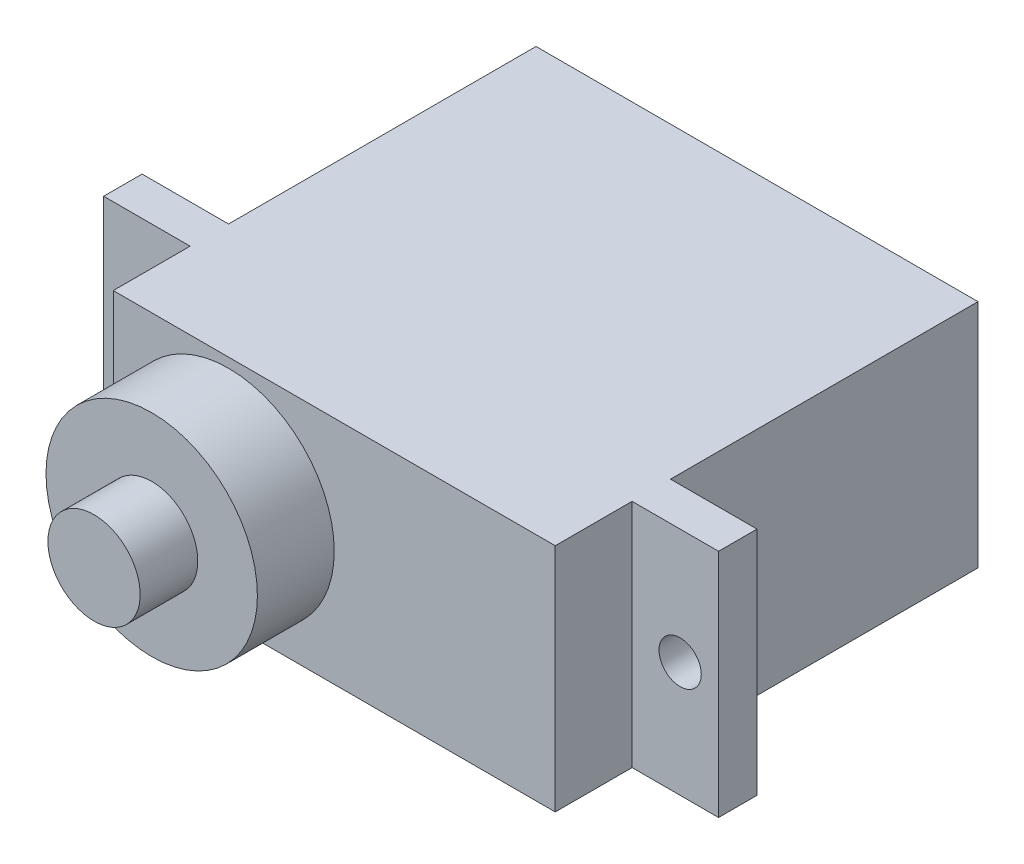
ISO-10303-21;
HEADER;
FILE_DESCRIPTION(('STEP AP214'),'2;1');
FILE_NAME('part.step','',(''),(''),'','','');
FILE_SCHEMA(('AUTOMOTIVE_DESIGN { 1 0 10303 214 1 1 1 1 }'));
ENDSEC;
DATA;
#1=APPLICATION_CONTEXT('core data for automotive mechanical design processes');
#2=APPLICATION_PROTOCOL_DEFINITION('international standard','automotive_design',2000,#1);
#3=PRODUCT_CONTEXT('',#1,'mechanical');
#4=PRODUCT('Part','Part','',(#3));
#5=PRODUCT_RELATED_PRODUCT_CATEGORY('part','',(#4));
#6=PRODUCT_DEFINITION_FORMATION('','',#4);
#7=PRODUCT_DEFINITION_CONTEXT('part definition',#1,'design');
#8=PRODUCT_DEFINITION('design','',#6,#7);
#9=PRODUCT_DEFINITION_SHAPE('','',#8);
#10=(LENGTH_UNIT() NAMED_UNIT(*) SI_UNIT(.MILLI.,.METRE.));
#11=(NAMED_UNIT(*) PLANE_ANGLE_UNIT() SI_UNIT($,.RADIAN.));
#12=(NAMED_UNIT(*) SI_UNIT($,.STERADIAN.) SOLID_ANGLE_UNIT());
#13=UNCERTAINTY_MEASURE_WITH_UNIT(LENGTH_MEASURE(1.E-05),#10,'distance_accuracy_value','');
#14=(GEOMETRIC_REPRESENTATION_CONTEXT(3) GLOBAL_UNCERTAINTY_ASSIGNED_CONTEXT((#13)) GLOBAL_UNIT_ASSIGNED_CONTEXT((#10,
#11,#12)) REPRESENTATION_CONTEXT('',''));
#15=CARTESIAN_POINT('',(0.,0.,0.));
#16=DIRECTION('',(0.,0.,1.));
#17=DIRECTION('',(1.,0.,0.));
#18=AXIS2_PLACEMENT_3D('',#15,#16,#17);
#19=CARTESIAN_POINT('',(-11.5,-6.,22.));
#20=DIRECTION('',(1.,0.,0.));
#21=DIRECTION('',(0.,0.,-1.));
#22=AXIS2_PLACEMENT_3D('',#19,#20,#21);
#23=PLANE('',#22);
#24=DIRECTION('',(0.,1.,0.));
#25=VECTOR('',#24,1.);
#26=CARTESIAN_POINT('',(-11.5,-6.,18.));
#27=LINE('',#26,#25);
#28=CARTESIAN_POINT('',(-11.5,-6.,18.));
#29=VERTEX_POINT('',#28);
#30=CARTESIAN_POINT('',(-11.5,6.,18.));
#31=VERTEX_POINT('',#30);
#32=EDGE_CURVE('E175',#29,#31,#27,.T.);
#33=ORIENTED_EDGE('',*,*,#32,.F.);
#34=DIRECTION('',(0.,0.,-1.));
#35=VECTOR('',#34,1.);
#36=CARTESIAN_POINT('',(-11.5,-6.,22.));
#37=LINE('',#36,#35);
#38=CARTESIAN_POINT('',(-11.5,-6.,22.));
#39=VERTEX_POINT('',#38);
#40=EDGE_CURVE('E144',#39,#29,#37,.T.);
#41=ORIENTED_EDGE('',*,*,#40,.F.);
#42=DIRECTION('',(0.,-1.,0.));
#43=VECTOR('',#42,1.);
#44=CARTESIAN_POINT('',(-11.5,-6.,22.));
#45=LINE('',#44,#43);
#46=CARTESIAN_POINT('',(-11.5,6.,22.));
#47=VERTEX_POINT('',#46);
#48=EDGE_CURVE('E181',#47,#39,#45,.T.);
#49=ORIENTED_EDGE('',*,*,#48,.F.);
#50=DIRECTION('',(0.,0.,-1.));
#51=VECTOR('',#50,1.);
#52=CARTESIAN_POINT('',(-11.5,6.,22.));
#53=LINE('',#52,#51);
#54=EDGE_CURVE('E215',#47,#31,#53,.T.);
#55=ORIENTED_EDGE('',*,*,#54,.T.);
#56=EDGE_LOOP('',(#33,#41,#49,#55));
#57=FACE_BOUND('',#56,.T.);
#58=ADVANCED_FACE('F44',(#57),#23,.F.);
#59=CARTESIAN_POINT('',(11.5,-6.,22.));
#60=DIRECTION('',(-1.,0.,0.));
#61=DIRECTION('',(0.,0.,1.));
#62=AXIS2_PLACEMENT_3D('',#59,#60,#61);
#63=PLANE('',#62);
#64=DIRECTION('',(0.,-1.,0.));
#65=VECTOR('',#64,1.);
#66=CARTESIAN_POINT('',(11.5,-6.,18.));
#67=LINE('',#66,#65);
#68=CARTESIAN_POINT('',(11.5,6.,18.));
#69=VERTEX_POINT('',#68);
#70=CARTESIAN_POINT('',(11.5,-6.,18.));
#71=VERTEX_POINT('',#70);
#72=EDGE_CURVE('E54',#69,#71,#67,.T.);
#73=ORIENTED_EDGE('',*,*,#72,.F.);
#74=DIRECTION('',(0.,0.,-1.));
#75=VECTOR('',#74,1.);
#76=CARTESIAN_POINT('',(11.5,6.,22.));
#77=LINE('',#76,#75);
#78=CARTESIAN_POINT('',(11.5,6.,22.));
#79=VERTEX_POINT('',#78);
#80=EDGE_CURVE('E220',#79,#69,#77,.T.);
#81=ORIENTED_EDGE('',*,*,#80,.F.);
#82=DIRECTION('',(0.,1.,0.));
#83=VECTOR('',#82,1.);
#84=CARTESIAN_POINT('',(11.5,-6.,22.));
#85=LINE('',#84,#83);
#86=CARTESIAN_POINT('',(11.5,-6.,22.));
#87=VERTEX_POINT('',#86);
#88=EDGE_CURVE('E191',#87,#79,#85,.T.);
#89=ORIENTED_EDGE('',*,*,#88,.F.);
#90=DIRECTION('',(0.,0.,-1.));
#91=VECTOR('',#90,1.);
#92=CARTESIAN_POINT('',(11.5,-6.,22.));
#93=LINE('',#92,#91);
#94=EDGE_CURVE('E225',#87,#71,#93,.T.);
#95=ORIENTED_EDGE('',*,*,#94,.T.);
#96=EDGE_LOOP('',(#73,#81,#89,#95));
#97=FACE_BOUND('',#96,.T.);
#98=ADVANCED_FACE('F328',(#97),#63,.F.);
#99=CARTESIAN_POINT('',(-11.5,-6.,16.));
#100=VERTEX_POINT('',#99);
#101=CARTESIAN_POINT('',(-11.5,-6.,0.));
#102=VERTEX_POINT('',#101);
#103=EDGE_CURVE('E227',#100,#102,#37,.T.);
#104=ORIENTED_EDGE('',*,*,#103,.F.);
#105=DIRECTION('',(0.,1.,0.));
#106=VECTOR('',#105,1.);
#107=CARTESIAN_POINT('',(-11.5,-6.,16.));
#108=LINE('',#107,#106);
#109=CARTESIAN_POINT('',(-11.5,6.,16.));
#110=VERTEX_POINT('',#109);
#111=EDGE_CURVE('E167',#100,#110,#108,.T.);
#112=ORIENTED_EDGE('',*,*,#111,.T.);
#113=CARTESIAN_POINT('',(-11.5,6.,0.));
#114=VERTEX_POINT('',#113);
#115=EDGE_CURVE('E197',#110,#114,#53,.T.);
#116=ORIENTED_EDGE('',*,*,#115,.T.);
#117=DIRECTION('',(0.,-1.,0.));
#118=VECTOR('',#117,1.);
#119=CARTESIAN_POINT('',(-11.5,-6.,0.));
#120=LINE('',#119,#118);
#121=EDGE_CURVE('E185',#114,#102,#120,.T.);
#122=ORIENTED_EDGE('',*,*,#121,.T.);
#123=EDGE_LOOP('',(#104,#112,#116,#122));
#124=FACE_BOUND('',#123,.T.);
#125=ADVANCED_FACE('F50',(#124),#23,.F.);
#126=CARTESIAN_POINT('',(-11.5,-6.,22.));
#127=DIRECTION('',(0.,1.,0.));
#128=DIRECTION('',(0.,0.,1.));
#129=AXIS2_PLACEMENT_3D('',#126,#127,#128);
#130=PLANE('',#129);
#131=ORIENTED_EDGE('',*,*,#40,.T.);
#132=DIRECTION('',(1.,0.,0.));
#133=VECTOR('',#132,1.);
#134=CARTESIAN_POINT('',(-16.,-6.,18.));
#135=LINE('',#134,#133);
#136=CARTESIAN_POINT('',(-16.,-6.,18.));
#137=VERTEX_POINT('',#136);
#138=EDGE_CURVE('E137',#137,#29,#135,.T.);
#139=ORIENTED_EDGE('',*,*,#138,.F.);
#140=DIRECTION('',(0.,0.,-1.));
#141=VECTOR('',#140,1.);
#142=CARTESIAN_POINT('',(-16.,-6.,18.));
#143=LINE('',#142,#141);
#144=CARTESIAN_POINT('',(-16.,-6.,16.));
#145=VERTEX_POINT('',#144);
#146=EDGE_CURVE('E142',#137,#145,#143,.T.);
#147=ORIENTED_EDGE('',*,*,#146,.T.);
#148=DIRECTION('',(1.,0.,0.));
#149=VECTOR('',#148,1.);
#150=CARTESIAN_POINT('',(-16.,-6.,16.));
#151=LINE('',#150,#149);
#152=EDGE_CURVE('E271',#145,#100,#151,.T.);
#153=ORIENTED_EDGE('',*,*,#152,.T.);
#154=ORIENTED_EDGE('',*,*,#103,.T.);
#155=DIRECTION('',(1.,0.,0.));
#156=VECTOR('',#155,1.);
#157=CARTESIAN_POINT('',(-11.5,-6.,0.));
#158=LINE('',#157,#156);
#159=CARTESIAN_POINT('',(11.5,-6.,0.));
#160=VERTEX_POINT('',#159);
#161=EDGE_CURVE('E203',#102,#160,#158,.T.);
#162=ORIENTED_EDGE('',*,*,#161,.T.);
#163=CARTESIAN_POINT('',(11.5,-6.,16.));
#164=VERTEX_POINT('',#163);
#165=EDGE_CURVE('E222',#164,#160,#93,.T.);
#166=ORIENTED_EDGE('',*,*,#165,.F.);
#167=CARTESIAN_POINT('',(16.,-6.,16.));
#168=VERTEX_POINT('',#167);
#169=EDGE_CURVE('E72',#164,#168,#151,.T.);
#170=ORIENTED_EDGE('',*,*,#169,.T.);
#171=DIRECTION('',(0.,0.,-1.));
#172=VECTOR('',#171,1.);
#173=CARTESIAN_POINT('',(16.,-6.,18.));
#174=LINE('',#173,#172);
#175=CARTESIAN_POINT('',(16.,-6.,18.));
#176=VERTEX_POINT('',#175);
#177=EDGE_CURVE('E170',#176,#168,#174,.T.);
#178=ORIENTED_EDGE('',*,*,#177,.F.);
#179=EDGE_CURVE('E147',#71,#176,#135,.T.);
#180=ORIENTED_EDGE('',*,*,#179,.F.);
#181=ORIENTED_EDGE('',*,*,#94,.F.);
#182=DIRECTION('',(1.,0.,0.));
#183=VECTOR('',#182,1.);
#184=CARTESIAN_POINT('',(-11.5,-6.,22.));
#185=LINE('',#184,#183);
#186=EDGE_CURVE('E190',#39,#87,#185,.T.);
#187=ORIENTED_EDGE('',*,*,#186,.F.);
#188=EDGE_LOOP('',(#131,#139,#147,#153,#154,#162,#166,#170,#178,#180,#181,#187));
#189=FACE_BOUND('',#188,.T.);
#190=ADVANCED_FACE('F138',(#189),#130,.F.);
#191=CARTESIAN_POINT('',(11.5,6.,16.));
#192=VERTEX_POINT('',#191);
#193=CARTESIAN_POINT('',(11.5,6.,0.));
#194=VERTEX_POINT('',#193);
#195=EDGE_CURVE('E216',#192,#194,#77,.T.);
#196=ORIENTED_EDGE('',*,*,#195,.F.);
#197=DIRECTION('',(0.,-1.,0.));
#198=VECTOR('',#197,1.);
#199=CARTESIAN_POINT('',(11.5,-6.,16.));
#200=LINE('',#199,#198);
#201=EDGE_CURVE('E229',#192,#164,#200,.T.);
#202=ORIENTED_EDGE('',*,*,#201,.T.);
#203=ORIENTED_EDGE('',*,*,#165,.T.);
#204=DIRECTION('',(0.,1.,0.));
#205=VECTOR('',#204,1.);
#206=CARTESIAN_POINT('',(11.5,-6.,0.));
#207=LINE('',#206,#205);
#208=EDGE_CURVE('E202',#160,#194,#207,.T.);
#209=ORIENTED_EDGE('',*,*,#208,.T.);
#210=EDGE_LOOP('',(#196,#202,#203,#209));
#211=FACE_BOUND('',#210,.T.);
#212=ADVANCED_FACE('F294',(#211),#63,.F.);
#213=CARTESIAN_POINT('',(-11.5,6.,22.));
#214=DIRECTION('',(0.,-1.,0.));
#215=DIRECTION('',(0.,0.,-1.));
#216=AXIS2_PLACEMENT_3D('',#213,#214,#215);
#217=PLANE('',#216);
#218=ORIENTED_EDGE('',*,*,#80,.T.);
#219=DIRECTION('',(-1.,0.,0.));
#220=VECTOR('',#219,1.);
#221=CARTESIAN_POINT('',(-16.,6.,18.));
#222=LINE('',#221,#220);
#223=CARTESIAN_POINT('',(16.,6.,18.));
#224=VERTEX_POINT('',#223);
#225=EDGE_CURVE('E264',#224,#69,#222,.T.);
#226=ORIENTED_EDGE('',*,*,#225,.F.);
#227=DIRECTION('',(0.,0.,-1.));
#228=VECTOR('',#227,1.);
#229=CARTESIAN_POINT('',(16.,6.,18.));
#230=LINE('',#229,#228);
#231=CARTESIAN_POINT('',(16.,6.,16.));
#232=VERTEX_POINT('',#231);
#233=EDGE_CURVE('E176',#224,#232,#230,.T.);
#234=ORIENTED_EDGE('',*,*,#233,.T.);
#235=DIRECTION('',(-1.,0.,0.));
#236=VECTOR('',#235,1.);
#237=CARTESIAN_POINT('',(-16.,6.,16.));
#238=LINE('',#237,#236);
#239=EDGE_CURVE('E161',#232,#192,#238,.T.);
#240=ORIENTED_EDGE('',*,*,#239,.T.);
#241=ORIENTED_EDGE('',*,*,#195,.T.);
#242=DIRECTION('',(-1.,0.,0.));
#243=VECTOR('',#242,1.);
#244=CARTESIAN_POINT('',(-11.5,6.,0.));
#245=LINE('',#244,#243);
#246=EDGE_CURVE('E188',#194,#114,#245,.T.);
#247=ORIENTED_EDGE('',*,*,#246,.T.);
#248=ORIENTED_EDGE('',*,*,#115,.F.);
#249=CARTESIAN_POINT('',(-16.,6.,16.));
#250=VERTEX_POINT('',#249);
#251=EDGE_CURVE('E63',#110,#250,#238,.T.);
#252=ORIENTED_EDGE('',*,*,#251,.T.);
#253=DIRECTION('',(0.,0.,-1.));
#254=VECTOR('',#253,1.);
#255=CARTESIAN_POINT('',(-16.,6.,18.));
#256=LINE('',#255,#254);
#257=CARTESIAN_POINT('',(-16.,6.,18.));
#258=VERTEX_POINT('',#257);
#259=EDGE_CURVE('E268',#258,#250,#256,.T.);
#260=ORIENTED_EDGE('',*,*,#259,.F.);
#261=EDGE_CURVE('E156',#31,#258,#222,.T.);
#262=ORIENTED_EDGE('',*,*,#261,.F.);
#263=ORIENTED_EDGE('',*,*,#54,.F.);
#264=DIRECTION('',(-1.,0.,0.));
#265=VECTOR('',#264,1.);
#266=CARTESIAN_POINT('',(-11.5,6.,22.));
#267=LINE('',#266,#265);
#268=EDGE_CURVE('E193',#79,#47,#267,.T.);
#269=ORIENTED_EDGE('',*,*,#268,.F.);
#270=EDGE_LOOP('',(#218,#226,#234,#240,#241,#247,#248,#252,#260,#262,#263,#269));
#271=FACE_BOUND('',#270,.T.);
#272=ADVANCED_FACE('F287',(#271),#217,.F.);
#273=CARTESIAN_POINT('',(0.,0.,22.));
#274=DIRECTION('',(0.,0.,-1.));
#275=DIRECTION('',(-1.,0.,0.));
#276=AXIS2_PLACEMENT_3D('',#273,#274,#275);
#277=PLANE('',#276);
#278=CARTESIAN_POINT('',(-5.5,0.,22.));
#279=DIRECTION('',(0.,0.,-1.));
#280=DIRECTION('',(-1.,0.,0.));
#281=AXIS2_PLACEMENT_3D('',#278,#279,#280);
#282=CIRCLE('',#281,5.5);
#283=CARTESIAN_POINT('',(-11.,0.,22.));
#284=VERTEX_POINT('',#283);
#285=EDGE_CURVE('E11',#284,#284,#282,.F.);
#286=ORIENTED_EDGE('',*,*,#285,.F.);
#287=EDGE_LOOP('',(#286));
#288=FACE_BOUND('',#287,.T.);
#289=ORIENTED_EDGE('',*,*,#48,.T.);
#290=ORIENTED_EDGE('',*,*,#186,.T.);
#291=ORIENTED_EDGE('',*,*,#88,.T.);
#292=ORIENTED_EDGE('',*,*,#268,.T.);
#293=EDGE_LOOP('',(#289,#290,#291,#292));
#294=FACE_BOUND('',#293,.T.);
#295=ADVANCED_FACE('F324',(#288,#294),#277,.F.);
#296=CARTESIAN_POINT('',(0.,0.,0.));
#297=DIRECTION('',(0.,0.,-1.));
#298=DIRECTION('',(-1.,0.,0.));
#299=AXIS2_PLACEMENT_3D('',#296,#297,#298);
#300=PLANE('',#299);
#301=ORIENTED_EDGE('',*,*,#121,.F.);
#302=ORIENTED_EDGE('',*,*,#246,.F.);
#303=ORIENTED_EDGE('',*,*,#208,.F.);
#304=ORIENTED_EDGE('',*,*,#161,.F.);
#305=EDGE_LOOP('',(#301,#302,#303,#304));
#306=FACE_BOUND('',#305,.T.);
#307=ADVANCED_FACE('F304',(#306),#300,.T.);
#308=CARTESIAN_POINT('',(16.,-6.,18.));
#309=DIRECTION('',(-1.,0.,0.));
#310=DIRECTION('',(0.,0.,1.));
#311=AXIS2_PLACEMENT_3D('',#308,#309,#310);
#312=PLANE('',#311);
#313=DIRECTION('',(0.,1.,0.));
#314=VECTOR('',#313,1.);
#315=CARTESIAN_POINT('',(16.,-6.,16.));
#316=LINE('',#315,#314);
#317=EDGE_CURVE('E273',#168,#232,#316,.T.);
#318=ORIENTED_EDGE('',*,*,#317,.T.);
#319=ORIENTED_EDGE('',*,*,#233,.F.);
#320=DIRECTION('',(0.,1.,0.));
#321=VECTOR('',#320,1.);
#322=CARTESIAN_POINT('',(16.,-6.,18.));
#323=LINE('',#322,#321);
#324=EDGE_CURVE('E149',#176,#224,#323,.T.);
#325=ORIENTED_EDGE('',*,*,#324,.F.);
#326=ORIENTED_EDGE('',*,*,#177,.T.);
#327=EDGE_LOOP('',(#318,#319,#325,#326));
#328=FACE_BOUND('',#327,.T.);
#329=ADVANCED_FACE('F316',(#328),#312,.F.);
#330=CARTESIAN_POINT('',(0.,0.,16.));
#331=DIRECTION('',(0.,0.,-1.));
#332=DIRECTION('',(-1.,0.,0.));
#333=AXIS2_PLACEMENT_3D('',#330,#331,#332);
#334=PLANE('',#333);
#335=CARTESIAN_POINT('',(14.,0.,16.));
#336=DIRECTION('',(0.,0.,-1.));
#337=DIRECTION('',(-1.,0.,0.));
#338=AXIS2_PLACEMENT_3D('',#335,#336,#337);
#339=CIRCLE('',#338,1.1);
#340=CARTESIAN_POINT('',(15.1,0.,16.));
#341=VERTEX_POINT('',#340);
#342=EDGE_CURVE('E251',#341,#341,#339,.T.);
#343=ORIENTED_EDGE('',*,*,#342,.F.);
#344=EDGE_LOOP('',(#343));
#345=FACE_BOUND('',#344,.T.);
#346=ORIENTED_EDGE('',*,*,#201,.F.);
#347=ORIENTED_EDGE('',*,*,#239,.F.);
#348=ORIENTED_EDGE('',*,*,#317,.F.);
#349=ORIENTED_EDGE('',*,*,#169,.F.);
#350=EDGE_LOOP('',(#346,#347,#348,#349));
#351=FACE_BOUND('',#350,.T.);
#352=ADVANCED_FACE('F292',(#345,#351),#334,.T.);
#353=CARTESIAN_POINT('',(0.,0.,18.));
#354=DIRECTION('',(0.,0.,-1.));
#355=DIRECTION('',(-1.,0.,0.));
#356=AXIS2_PLACEMENT_3D('',#353,#354,#355);
#357=PLANE('',#356);
#358=CARTESIAN_POINT('',(14.,0.,18.));
#359=DIRECTION('',(0.,0.,-1.));
#360=DIRECTION('',(-1.,0.,0.));
#361=AXIS2_PLACEMENT_3D('',#358,#359,#360);
#362=CIRCLE('',#361,1.1);
#363=CARTESIAN_POINT('',(15.1,0.,18.));
#364=VERTEX_POINT('',#363);
#365=EDGE_CURVE('E47',#364,#364,#362,.T.);
#366=ORIENTED_EDGE('',*,*,#365,.T.);
#367=EDGE_LOOP('',(#366));
#368=FACE_BOUND('',#367,.T.);
#369=ORIENTED_EDGE('',*,*,#225,.T.);
#370=ORIENTED_EDGE('',*,*,#72,.T.);
#371=ORIENTED_EDGE('',*,*,#179,.T.);
#372=ORIENTED_EDGE('',*,*,#324,.T.);
#373=EDGE_LOOP('',(#369,#370,#371,#372));
#374=FACE_BOUND('',#373,.T.);
#375=ADVANCED_FACE('F311',(#368,#374),#357,.F.);
#376=CARTESIAN_POINT('',(-14.,0.,18.));
#377=DIRECTION('',(0.,0.,-1.));
#378=DIRECTION('',(-1.,0.,0.));
#379=AXIS2_PLACEMENT_3D('',#376,#377,#378);
#380=CIRCLE('',#379,1.1);
#381=CARTESIAN_POINT('',(-12.9,0.,18.));
#382=VERTEX_POINT('',#381);
#383=EDGE_CURVE('E245',#382,#382,#380,.T.);
#384=ORIENTED_EDGE('',*,*,#383,.T.);
#385=EDGE_LOOP('',(#384));
#386=FACE_BOUND('',#385,.T.);
#387=ORIENTED_EDGE('',*,*,#138,.T.);
#388=ORIENTED_EDGE('',*,*,#32,.T.);
#389=ORIENTED_EDGE('',*,*,#261,.T.);
#390=DIRECTION('',(0.,-1.,0.));
#391=VECTOR('',#390,1.);
#392=CARTESIAN_POINT('',(-16.,-6.,18.));
#393=LINE('',#392,#391);
#394=EDGE_CURVE('E153',#258,#137,#393,.T.);
#395=ORIENTED_EDGE('',*,*,#394,.T.);
#396=EDGE_LOOP('',(#387,#388,#389,#395));
#397=FACE_BOUND('',#396,.T.);
#398=ADVANCED_FACE('F152',(#386,#397),#357,.F.);
#399=CARTESIAN_POINT('',(-14.,0.,16.));
#400=DIRECTION('',(0.,0.,-1.));
#401=DIRECTION('',(-1.,0.,0.));
#402=AXIS2_PLACEMENT_3D('',#399,#400,#401);
#403=CIRCLE('',#402,1.1);
#404=CARTESIAN_POINT('',(-12.9,0.,16.));
#405=VERTEX_POINT('',#404);
#406=EDGE_CURVE('E239',#405,#405,#403,.T.);
#407=ORIENTED_EDGE('',*,*,#406,.F.);
#408=EDGE_LOOP('',(#407));
#409=FACE_BOUND('',#408,.T.);
#410=ORIENTED_EDGE('',*,*,#111,.F.);
#411=ORIENTED_EDGE('',*,*,#152,.F.);
#412=DIRECTION('',(0.,-1.,0.));
#413=VECTOR('',#412,1.);
#414=CARTESIAN_POINT('',(-16.,-6.,16.));
#415=LINE('',#414,#413);
#416=EDGE_CURVE('E163',#250,#145,#415,.T.);
#417=ORIENTED_EDGE('',*,*,#416,.F.);
#418=ORIENTED_EDGE('',*,*,#251,.F.);
#419=EDGE_LOOP('',(#410,#411,#417,#418));
#420=FACE_BOUND('',#419,.T.);
#421=ADVANCED_FACE('F322',(#409,#420),#334,.T.);
#422=CARTESIAN_POINT('',(-16.,-6.,18.));
#423=DIRECTION('',(1.,0.,0.));
#424=DIRECTION('',(0.,0.,-1.));
#425=AXIS2_PLACEMENT_3D('',#422,#423,#424);
#426=PLANE('',#425);
#427=ORIENTED_EDGE('',*,*,#416,.T.);
#428=ORIENTED_EDGE('',*,*,#146,.F.);
#429=ORIENTED_EDGE('',*,*,#394,.F.);
#430=ORIENTED_EDGE('',*,*,#259,.T.);
#431=EDGE_LOOP('',(#427,#428,#429,#430));
#432=FACE_BOUND('',#431,.T.);
#433=ADVANCED_FACE('F162',(#432),#426,.F.);
#434=CARTESIAN_POINT('',(-5.5,0.,26.));
#435=DIRECTION('',(0.,0.,-1.));
#436=DIRECTION('',(-1.,0.,0.));
#437=AXIS2_PLACEMENT_3D('',#434,#435,#436);
#438=CYLINDRICAL_SURFACE('',#437,5.5);
#439=CARTESIAN_POINT('',(-5.5,0.,26.));
#440=DIRECTION('',(0.,0.,1.));
#441=DIRECTION('',(1.,0.,0.));
#442=AXIS2_PLACEMENT_3D('',#439,#440,#441);
#443=CIRCLE('',#442,5.5);
#444=CARTESIAN_POINT('',(-11.,0.,26.));
#445=VERTEX_POINT('',#444);
#446=EDGE_CURVE('E240',#445,#445,#443,.T.);
#447=CARTESIAN_POINT('',(-11.,0.,26.));
#448=CARTESIAN_POINT('',(-11.,0.,25.9583333333333));
#449=CARTESIAN_POINT('',(-11.,0.,25.9166666666667));
#450=CARTESIAN_POINT('',(-11.,0.,25.8333333333333));
#451=CARTESIAN_POINT('',(-11.,0.,25.7916666666667));
#452=CARTESIAN_POINT('',(-11.,0.,25.7083333333333));
#453=CARTESIAN_POINT('',(-11.,0.,25.6666666666667));
#454=CARTESIAN_POINT('',(-11.,0.,25.5833333333333));
#455=CARTESIAN_POINT('',(-11.,0.,25.5416666666667));
#456=CARTESIAN_POINT('',(-11.,0.,25.4583333333333));
#457=CARTESIAN_POINT('',(-11.,0.,25.4166666666667));
#458=CARTESIAN_POINT('',(-11.,0.,25.3333333333333));
#459=CARTESIAN_POINT('',(-11.,0.,25.2916666666667));
#460=CARTESIAN_POINT('',(-11.,0.,25.2083333333333));
#461=CARTESIAN_POINT('',(-11.,0.,25.1666666666667));
#462=CARTESIAN_POINT('',(-11.,0.,25.0833333333333));
#463=CARTESIAN_POINT('',(-11.,0.,25.0416666666667));
#464=CARTESIAN_POINT('',(-11.,0.,24.9583333333333));
#465=CARTESIAN_POINT('',(-11.,0.,24.9166666666667));
#466=CARTESIAN_POINT('',(-11.,0.,24.8333333333333));
#467=CARTESIAN_POINT('',(-11.,0.,24.7916666666667));
#468=CARTESIAN_POINT('',(-11.,0.,24.7083333333333));
#469=CARTESIAN_POINT('',(-11.,0.,24.6666666666667));
#470=CARTESIAN_POINT('',(-11.,0.,24.5833333333333));
#471=CARTESIAN_POINT('',(-11.,0.,24.5416666666667));
#472=CARTESIAN_POINT('',(-11.,0.,24.4583333333333));
#473=CARTESIAN_POINT('',(-11.,0.,24.4166666666667));
#474=CARTESIAN_POINT('',(-11.,0.,24.3333333333333));
#475=CARTESIAN_POINT('',(-11.,0.,24.2916666666667));
#476=CARTESIAN_POINT('',(-11.,0.,24.2083333333333));
#477=CARTESIAN_POINT('',(-11.,0.,24.1666666666667));
#478=CARTESIAN_POINT('',(-11.,0.,24.0833333333333));
#479=CARTESIAN_POINT('',(-11.,0.,24.0416666666667));
#480=CARTESIAN_POINT('',(-11.,0.,23.9583333333333));
#481=CARTESIAN_POINT('',(-11.,0.,23.9166666666667));
#482=CARTESIAN_POINT('',(-11.,0.,23.8333333333333));
#483=CARTESIAN_POINT('',(-11.,0.,23.7916666666667));
#484=CARTESIAN_POINT('',(-11.,0.,23.7083333333333));
#485=CARTESIAN_POINT('',(-11.,0.,23.6666666666667));
#486=CARTESIAN_POINT('',(-11.,0.,23.5833333333333));
#487=CARTESIAN_POINT('',(-11.,0.,23.5416666666667));
#488=CARTESIAN_POINT('',(-11.,0.,23.4583333333333));
#489=CARTESIAN_POINT('',(-11.,0.,23.4166666666667));
#490=CARTESIAN_POINT('',(-11.,0.,23.3333333333333));
#491=CARTESIAN_POINT('',(-11.,0.,23.2916666666667));
#492=CARTESIAN_POINT('',(-11.,0.,23.2083333333333));
#493=CARTESIAN_POINT('',(-11.,0.,23.1666666666667));
#494=CARTESIAN_POINT('',(-11.,0.,23.0833333333333));
#495=CARTESIAN_POINT('',(-11.,0.,23.0416666666667));
#496=CARTESIAN_POINT('',(-11.,0.,22.9583333333333));
#497=CARTESIAN_POINT('',(-11.,0.,22.9166666666667));
#498=CARTESIAN_POINT('',(-11.,0.,22.8333333333333));
#499=CARTESIAN_POINT('',(-11.,0.,22.7916666666667));
#500=CARTESIAN_POINT('',(-11.,0.,22.7083333333333));
#501=CARTESIAN_POINT('',(-11.,0.,22.6666666666667));
#502=CARTESIAN_POINT('',(-11.,0.,22.5833333333333));
#503=CARTESIAN_POINT('',(-11.,0.,22.5416666666667));
#504=CARTESIAN_POINT('',(-11.,0.,22.4583333333333));
#505=CARTESIAN_POINT('',(-11.,0.,22.4166666666667));
#506=CARTESIAN_POINT('',(-11.,0.,22.3333333333333));
#507=CARTESIAN_POINT('',(-11.,0.,22.2916666666667));
#508=CARTESIAN_POINT('',(-11.,0.,22.2083333333333));
#509=CARTESIAN_POINT('',(-11.,0.,22.1666666666667));
#510=CARTESIAN_POINT('',(-11.,0.,22.0833333333333));
#511=CARTESIAN_POINT('',(-11.,0.,22.0416666666667));
#512=CARTESIAN_POINT('',(-11.,0.,22.));
#513=B_SPLINE_CURVE_WITH_KNOTS('',3,(#447,#448,#449,#450,#451,#452,#453,#454,#455,#456,#457,
#458,#459,#460,#461,#462,#463,#464,#465,#466,#467,#468,#469,#470,#471,#472,#473,#474,#475,#476,
#477,#478,#479,#480,#481,#482,#483,#484,#485,#486,#487,#488,#489,#490,#491,#492,#493,#494,#495,
#496,#497,#498,#499,#500,#501,#502,#503,#504,#505,#506,#507,#508,#509,#510,#511,#512),
.UNSPECIFIED.,.F.,.F.,(4,2,2,2,2,2,2,2,2,2,2,2,2,2,2,2,2,2,2,2,2,2,2,2,2,2,2,2,2,2,2,2,4),(0.,
0.125,0.25,0.375,0.5,0.625000000000001,0.750000000000001,0.875000000000001,1.,1.125,1.25,1.375,
1.5,1.625,1.75,1.875,2.,2.125,2.25,2.375,2.5,2.625,2.75,2.875,3.,3.125,3.25,3.375,3.5,3.625,
3.75,3.875,4.),.UNSPECIFIED.);
#514=EDGE_CURVE('BSEAM344',#445,#284,#513,.T.);
#515=ORIENTED_EDGE('',*,*,#446,.F.);
#516=ORIENTED_EDGE('',*,*,#285,.T.);
#517=ORIENTED_EDGE('',*,*,#514,.T.);
#518=ORIENTED_EDGE('',*,*,#514,.F.);
#519=EDGE_LOOP('',(#515,#517,#516,#518));
#520=FACE_BOUND('',#519,.T.);
#521=ADVANCED_FACE('F344',(#520),#438,.T.);
#522=CARTESIAN_POINT('',(-5.5,0.,26.));
#523=DIRECTION('',(0.,0.,1.));
#524=DIRECTION('',(1.,0.,0.));
#525=AXIS2_PLACEMENT_3D('',#522,#523,#524);
#526=PLANE('',#525);
#527=CARTESIAN_POINT('',(-5.5,0.,26.));
#528=DIRECTION('',(0.,0.,1.));
#529=DIRECTION('',(1.,0.,0.));
#530=AXIS2_PLACEMENT_3D('',#527,#528,#529);
#531=CIRCLE('',#530,2.4);
#532=CARTESIAN_POINT('',(-7.9,0.,26.));
#533=VERTEX_POINT('',#532);
#534=EDGE_CURVE('E233',#533,#533,#531,.F.);
#535=ORIENTED_EDGE('',*,*,#534,.T.);
#536=EDGE_LOOP('',(#535));
#537=FACE_BOUND('',#536,.T.);
#538=ORIENTED_EDGE('',*,*,#446,.T.);
#539=EDGE_LOOP('',(#538));
#540=FACE_BOUND('',#539,.T.);
#541=ADVANCED_FACE('F346',(#537,#540),#526,.T.);
#542=CARTESIAN_POINT('',(-5.5,0.,29.));
#543=DIRECTION('',(0.,0.,-1.));
#544=DIRECTION('',(-1.,0.,0.));
#545=AXIS2_PLACEMENT_3D('',#542,#543,#544);
#546=CYLINDRICAL_SURFACE('',#545,2.4);
#547=CARTESIAN_POINT('',(-5.5,0.,29.));
#548=DIRECTION('',(0.,0.,1.));
#549=DIRECTION('',(1.,0.,0.));
#550=AXIS2_PLACEMENT_3D('',#547,#548,#549);
#551=CIRCLE('',#550,2.4);
#552=CARTESIAN_POINT('',(-7.9,0.,29.));
#553=VERTEX_POINT('',#552);
#554=EDGE_CURVE('E236',#553,#553,#551,.T.);
#555=CARTESIAN_POINT('',(-7.9,0.,26.));
#556=CARTESIAN_POINT('',(-7.9,0.,26.03125));
#557=CARTESIAN_POINT('',(-7.9,0.,26.0625));
#558=CARTESIAN_POINT('',(-7.9,0.,26.125));
#559=CARTESIAN_POINT('',(-7.9,0.,26.15625));
#560=CARTESIAN_POINT('',(-7.9,0.,26.21875));
#561=CARTESIAN_POINT('',(-7.9,0.,26.25));
#562=CARTESIAN_POINT('',(-7.9,0.,26.3125));
#563=CARTESIAN_POINT('',(-7.9,0.,26.34375));
#564=CARTESIAN_POINT('',(-7.9,0.,26.40625));
#565=CARTESIAN_POINT('',(-7.9,0.,26.4375));
#566=CARTESIAN_POINT('',(-7.9,0.,26.5));
#567=CARTESIAN_POINT('',(-7.9,0.,26.53125));
#568=CARTESIAN_POINT('',(-7.9,0.,26.59375));
#569=CARTESIAN_POINT('',(-7.9,0.,26.625));
#570=CARTESIAN_POINT('',(-7.9,0.,26.6875));
#571=CARTESIAN_POINT('',(-7.9,0.,26.71875));
#572=CARTESIAN_POINT('',(-7.9,0.,26.78125));
#573=CARTESIAN_POINT('',(-7.9,0.,26.8125));
#574=CARTESIAN_POINT('',(-7.9,0.,26.875));
#575=CARTESIAN_POINT('',(-7.9,0.,26.90625));
#576=CARTESIAN_POINT('',(-7.9,0.,26.96875));
#577=CARTESIAN_POINT('',(-7.9,0.,27.));
#578=CARTESIAN_POINT('',(-7.9,0.,27.0625));
#579=CARTESIAN_POINT('',(-7.9,0.,27.09375));
#580=CARTESIAN_POINT('',(-7.9,0.,27.15625));
#581=CARTESIAN_POINT('',(-7.9,0.,27.1875));
#582=CARTESIAN_POINT('',(-7.9,0.,27.25));
#583=CARTESIAN_POINT('',(-7.9,0.,27.28125));
#584=CARTESIAN_POINT('',(-7.9,0.,27.34375));
#585=CARTESIAN_POINT('',(-7.9,0.,27.375));
#586=CARTESIAN_POINT('',(-7.9,0.,27.4375));
#587=CARTESIAN_POINT('',(-7.9,0.,27.46875));
#588=CARTESIAN_POINT('',(-7.9,0.,27.53125));
#589=CARTESIAN_POINT('',(-7.9,0.,27.5625));
#590=CARTESIAN_POINT('',(-7.9,0.,27.625));
#591=CARTESIAN_POINT('',(-7.9,0.,27.65625));
#592=CARTESIAN_POINT('',(-7.9,0.,27.71875));
#593=CARTESIAN_POINT('',(-7.9,0.,27.75));
#594=CARTESIAN_POINT('',(-7.9,0.,27.8125));
#595=CARTESIAN_POINT('',(-7.9,0.,27.84375));
#596=CARTESIAN_POINT('',(-7.9,0.,27.90625));
#597=CARTESIAN_POINT('',(-7.9,0.,27.9375));
#598=CARTESIAN_POINT('',(-7.9,0.,28.));
#599=CARTESIAN_POINT('',(-7.9,0.,28.03125));
#600=CARTESIAN_POINT('',(-7.9,0.,28.09375));
#601=CARTESIAN_POINT('',(-7.9,0.,28.125));
#602=CARTESIAN_POINT('',(-7.9,0.,28.1875));
#603=CARTESIAN_POINT('',(-7.9,0.,28.21875));
#604=CARTESIAN_POINT('',(-7.9,0.,28.28125));
#605=CARTESIAN_POINT('',(-7.9,0.,28.3125));
#606=CARTESIAN_POINT('',(-7.9,0.,28.375));
#607=CARTESIAN_POINT('',(-7.9,0.,28.40625));
#608=CARTESIAN_POINT('',(-7.9,0.,28.46875));
#609=CARTESIAN_POINT('',(-7.9,0.,28.5));
#610=CARTESIAN_POINT('',(-7.9,0.,28.5625));
#611=CARTESIAN_POINT('',(-7.9,0.,28.59375));
#612=CARTESIAN_POINT('',(-7.9,0.,28.65625));
#613=CARTESIAN_POINT('',(-7.9,0.,28.6875));
#614=CARTESIAN_POINT('',(-7.9,0.,28.75));
#615=CARTESIAN_POINT('',(-7.9,0.,28.78125));
#616=CARTESIAN_POINT('',(-7.9,0.,28.84375));
#617=CARTESIAN_POINT('',(-7.9,0.,28.875));
#618=CARTESIAN_POINT('',(-7.9,0.,28.9375));
#619=CARTESIAN_POINT('',(-7.9,0.,28.96875));
#620=CARTESIAN_POINT('',(-7.9,0.,29.));
#621=B_SPLINE_CURVE_WITH_KNOTS('',3,(#555,#556,#557,#558,#559,#560,#561,#562,#563,#564,#565,
#566,#567,#568,#569,#570,#571,#572,#573,#574,#575,#576,#577,#578,#579,#580,#581,#582,#583,#584,
#585,#586,#587,#588,#589,#590,#591,#592,#593,#594,#595,#596,#597,#598,#599,#600,#601,#602,#603,
#604,#605,#606,#607,#608,#609,#610,#611,#612,#613,#614,#615,#616,#617,#618,#619,#620),
.UNSPECIFIED.,.F.,.F.,(4,2,2,2,2,2,2,2,2,2,2,2,2,2,2,2,2,2,2,2,2,2,2,2,2,2,2,2,2,2,2,2,4),(0.,
0.0937500000000001,0.1875,0.28125,0.375,0.46875,0.5625,0.656250000000001,0.750000000000001,
0.843750000000001,0.937500000000001,1.03125,1.125,1.21875,1.3125,1.40625,1.5,1.59375,1.6875,
1.78125,1.875,1.96875,2.0625,2.15625,2.25,2.34375,2.4375,2.53125,2.625,2.71875,2.8125,2.90625,
3.),.UNSPECIFIED.);
#622=EDGE_CURVE('BSEAM355',#533,#553,#621,.T.);
#623=ORIENTED_EDGE('',*,*,#534,.F.);
#624=ORIENTED_EDGE('',*,*,#554,.F.);
#625=ORIENTED_EDGE('',*,*,#622,.T.);
#626=ORIENTED_EDGE('',*,*,#622,.F.);
#627=EDGE_LOOP('',(#623,#625,#624,#626));
#628=FACE_BOUND('',#627,.T.);
#629=ADVANCED_FACE('F355',(#628),#546,.T.);
#630=CARTESIAN_POINT('',(-5.5,0.,29.));
#631=DIRECTION('',(0.,0.,1.));
#632=DIRECTION('',(1.,0.,0.));
#633=AXIS2_PLACEMENT_3D('',#630,#631,#632);
#634=PLANE('',#633);
#635=ORIENTED_EDGE('',*,*,#554,.T.);
#636=EDGE_LOOP('',(#635));
#637=FACE_BOUND('',#636,.T.);
#638=ADVANCED_FACE('F356',(#637),#634,.T.);
#639=CARTESIAN_POINT('',(-14.,0.,-1.2E-05));
#640=DIRECTION('',(0.,0.,1.));
#641=DIRECTION('',(1.,0.,0.));
#642=AXIS2_PLACEMENT_3D('',#639,#640,#641);
#643=CYLINDRICAL_SURFACE('',#642,1.1);
#644=CARTESIAN_POINT('',(-12.9,0.,16.));
#645=CARTESIAN_POINT('',(-12.9,0.,16.0208333333333));
#646=CARTESIAN_POINT('',(-12.9,0.,16.0416666666667));
#647=CARTESIAN_POINT('',(-12.9,0.,16.0833333333333));
#648=CARTESIAN_POINT('',(-12.9,0.,16.1041666666667));
#649=CARTESIAN_POINT('',(-12.9,0.,16.1458333333333));
#650=CARTESIAN_POINT('',(-12.9,0.,16.1666666666667));
#651=CARTESIAN_POINT('',(-12.9,0.,16.2083333333333));
#652=CARTESIAN_POINT('',(-12.9,0.,16.2291666666667));
#653=CARTESIAN_POINT('',(-12.9,0.,16.2708333333333));
#654=CARTESIAN_POINT('',(-12.9,0.,16.2916666666667));
#655=CARTESIAN_POINT('',(-12.9,0.,16.3333333333333));
#656=CARTESIAN_POINT('',(-12.9,0.,16.3541666666667));
#657=CARTESIAN_POINT('',(-12.9,0.,16.3958333333333));
#658=CARTESIAN_POINT('',(-12.9,0.,16.4166666666667));
#659=CARTESIAN_POINT('',(-12.9,0.,16.4583333333333));
#660=CARTESIAN_POINT('',(-12.9,0.,16.4791666666667));
#661=CARTESIAN_POINT('',(-12.9,0.,16.5208333333333));
#662=CARTESIAN_POINT('',(-12.9,0.,16.5416666666667));
#663=CARTESIAN_POINT('',(-12.9,0.,16.5833333333333));
#664=CARTESIAN_POINT('',(-12.9,0.,16.6041666666667));
#665=CARTESIAN_POINT('',(-12.9,0.,16.6458333333333));
#666=CARTESIAN_POINT('',(-12.9,0.,16.6666666666667));
#667=CARTESIAN_POINT('',(-12.9,0.,16.7083333333333));
#668=CARTESIAN_POINT('',(-12.9,0.,16.7291666666667));
#669=CARTESIAN_POINT('',(-12.9,0.,16.7708333333333));
#670=CARTESIAN_POINT('',(-12.9,0.,16.7916666666667));
#671=CARTESIAN_POINT('',(-12.9,0.,16.8333333333333));
#672=CARTESIAN_POINT('',(-12.9,0.,16.8541666666667));
#673=CARTESIAN_POINT('',(-12.9,0.,16.8958333333333));
#674=CARTESIAN_POINT('',(-12.9,0.,16.9166666666667));
#675=CARTESIAN_POINT('',(-12.9,0.,16.9583333333333));
#676=CARTESIAN_POINT('',(-12.9,0.,16.9791666666667));
#677=CARTESIAN_POINT('',(-12.9,0.,17.0208333333333));
#678=CARTESIAN_POINT('',(-12.9,0.,17.0416666666667));
#679=CARTESIAN_POINT('',(-12.9,0.,17.0833333333333));
#680=CARTESIAN_POINT('',(-12.9,0.,17.1041666666667));
#681=CARTESIAN_POINT('',(-12.9,0.,17.1458333333333));
#682=CARTESIAN_POINT('',(-12.9,0.,17.1666666666667));
#683=CARTESIAN_POINT('',(-12.9,0.,17.2083333333333));
#684=CARTESIAN_POINT('',(-12.9,0.,17.2291666666667));
#685=CARTESIAN_POINT('',(-12.9,0.,17.2708333333333));
#686=CARTESIAN_POINT('',(-12.9,0.,17.2916666666667));
#687=CARTESIAN_POINT('',(-12.9,0.,17.3333333333333));
#688=CARTESIAN_POINT('',(-12.9,0.,17.3541666666667));
#689=CARTESIAN_POINT('',(-12.9,0.,17.3958333333333));
#690=CARTESIAN_POINT('',(-12.9,0.,17.4166666666667));
#691=CARTESIAN_POINT('',(-12.9,0.,17.4583333333333));
#692=CARTESIAN_POINT('',(-12.9,0.,17.4791666666667));
#693=CARTESIAN_POINT('',(-12.9,0.,17.5208333333333));
#694=CARTESIAN_POINT('',(-12.9,0.,17.5416666666667));
#695=CARTESIAN_POINT('',(-12.9,0.,17.5833333333333));
#696=CARTESIAN_POINT('',(-12.9,0.,17.6041666666667));
#697=CARTESIAN_POINT('',(-12.9,0.,17.6458333333333));
#698=CARTESIAN_POINT('',(-12.9,0.,17.6666666666667));
#699=CARTESIAN_POINT('',(-12.9,0.,17.7083333333333));
#700=CARTESIAN_POINT('',(-12.9,0.,17.7291666666667));
#701=CARTESIAN_POINT('',(-12.9,0.,17.7708333333333));
#702=CARTESIAN_POINT('',(-12.9,0.,17.7916666666667));
#703=CARTESIAN_POINT('',(-12.9,0.,17.8333333333333));
#704=CARTESIAN_POINT('',(-12.9,0.,17.8541666666667));
#705=CARTESIAN_POINT('',(-12.9,0.,17.8958333333333));
#706=CARTESIAN_POINT('',(-12.9,0.,17.9166666666667));
#707=CARTESIAN_POINT('',(-12.9,0.,17.9583333333333));
#708=CARTESIAN_POINT('',(-12.9,0.,17.9791666666667));
#709=CARTESIAN_POINT('',(-12.9,0.,18.));
#710=B_SPLINE_CURVE_WITH_KNOTS('',3,(#644,#645,#646,#647,#648,#649,#650,#651,#652,#653,#654,
#655,#656,#657,#658,#659,#660,#661,#662,#663,#664,#665,#666,#667,#668,#669,#670,#671,#672,#673,
#674,#675,#676,#677,#678,#679,#680,#681,#682,#683,#684,#685,#686,#687,#688,#689,#690,#691,#692,
#693,#694,#695,#696,#697,#698,#699,#700,#701,#702,#703,#704,#705,#706,#707,#708,#709),
.UNSPECIFIED.,.F.,.F.,(4,2,2,2,2,2,2,2,2,2,2,2,2,2,2,2,2,2,2,2,2,2,2,2,2,2,2,2,2,2,2,2,4),(0.,
0.0625000000000001,0.125,0.1875,0.25,0.3125,0.375,0.4375,0.5,0.5625,0.625000000000001,
0.687500000000001,0.750000000000001,0.812500000000001,0.875000000000001,0.937500000000001,1.,
1.0625,1.125,1.1875,1.25,1.3125,1.375,1.4375,1.5,1.5625,1.625,1.6875,1.75,1.8125,1.875,1.9375,
2.),.UNSPECIFIED.);
#711=EDGE_CURVE('BSEAM360',#405,#382,#710,.T.);
#712=ORIENTED_EDGE('',*,*,#406,.T.);
#713=ORIENTED_EDGE('',*,*,#383,.F.);
#714=ORIENTED_EDGE('',*,*,#711,.T.);
#715=ORIENTED_EDGE('',*,*,#711,.F.);
#716=EDGE_LOOP('',(#712,#714,#713,#715));
#717=FACE_BOUND('',#716,.T.);
#718=ADVANCED_FACE('F360',(#717),#643,.F.);
#719=CARTESIAN_POINT('',(14.,0.,-1.2E-05));
#720=DIRECTION('',(0.,0.,1.));
#721=DIRECTION('',(1.,0.,0.));
#722=AXIS2_PLACEMENT_3D('',#719,#720,#721);
#723=CYLINDRICAL_SURFACE('',#722,1.1);
#724=CARTESIAN_POINT('',(15.1,0.,16.));
#725=CARTESIAN_POINT('',(15.1,0.,16.0208333333333));
#726=CARTESIAN_POINT('',(15.1,0.,16.0416666666667));
#727=CARTESIAN_POINT('',(15.1,0.,16.0833333333333));
#728=CARTESIAN_POINT('',(15.1,0.,16.1041666666667));
#729=CARTESIAN_POINT('',(15.1,0.,16.1458333333333));
#730=CARTESIAN_POINT('',(15.1,0.,16.1666666666667));
#731=CARTESIAN_POINT('',(15.1,0.,16.2083333333333));
#732=CARTESIAN_POINT('',(15.1,0.,16.2291666666667));
#733=CARTESIAN_POINT('',(15.1,0.,16.2708333333333));
#734=CARTESIAN_POINT('',(15.1,0.,16.2916666666667));
#735=CARTESIAN_POINT('',(15.1,0.,16.3333333333333));
#736=CARTESIAN_POINT('',(15.1,0.,16.3541666666667));
#737=CARTESIAN_POINT('',(15.1,0.,16.3958333333333));
#738=CARTESIAN_POINT('',(15.1,0.,16.4166666666667));
#739=CARTESIAN_POINT('',(15.1,0.,16.4583333333333));
#740=CARTESIAN_POINT('',(15.1,0.,16.4791666666667));
#741=CARTESIAN_POINT('',(15.1,0.,16.5208333333333));
#742=CARTESIAN_POINT('',(15.1,0.,16.5416666666667));
#743=CARTESIAN_POINT('',(15.1,0.,16.5833333333333));
#744=CARTESIAN_POINT('',(15.1,0.,16.6041666666667));
#745=CARTESIAN_POINT('',(15.1,0.,16.6458333333333));
#746=CARTESIAN_POINT('',(15.1,0.,16.6666666666667));
#747=CARTESIAN_POINT('',(15.1,0.,16.7083333333333));
#748=CARTESIAN_POINT('',(15.1,0.,16.7291666666667));
#749=CARTESIAN_POINT('',(15.1,0.,16.7708333333333));
#750=CARTESIAN_POINT('',(15.1,0.,16.7916666666667));
#751=CARTESIAN_POINT('',(15.1,0.,16.8333333333333));
#752=CARTESIAN_POINT('',(15.1,0.,16.8541666666667));
#753=CARTESIAN_POINT('',(15.1,0.,16.8958333333333));
#754=CARTESIAN_POINT('',(15.1,0.,16.9166666666667));
#755=CARTESIAN_POINT('',(15.1,0.,16.9583333333333));
#756=CARTESIAN_POINT('',(15.1,0.,16.9791666666667));
#757=CARTESIAN_POINT('',(15.1,0.,17.0208333333333));
#758=CARTESIAN_POINT('',(15.1,0.,17.0416666666667));
#759=CARTESIAN_POINT('',(15.1,0.,17.0833333333333));
#760=CARTESIAN_POINT('',(15.1,0.,17.1041666666667));
#761=CARTESIAN_POINT('',(15.1,0.,17.1458333333333));
#762=CARTESIAN_POINT('',(15.1,0.,17.1666666666667));
#763=CARTESIAN_POINT('',(15.1,0.,17.2083333333333));
#764=CARTESIAN_POINT('',(15.1,0.,17.2291666666667));
#765=CARTESIAN_POINT('',(15.1,0.,17.2708333333333));
#766=CARTESIAN_POINT('',(15.1,0.,17.2916666666667));
#767=CARTESIAN_POINT('',(15.1,0.,17.3333333333333));
#768=CARTESIAN_POINT('',(15.1,0.,17.3541666666667));
#769=CARTESIAN_POINT('',(15.1,0.,17.3958333333333));
#770=CARTESIAN_POINT('',(15.1,0.,17.4166666666667));
#771=CARTESIAN_POINT('',(15.1,0.,17.4583333333333));
#772=CARTESIAN_POINT('',(15.1,0.,17.4791666666667));
#773=CARTESIAN_POINT('',(15.1,0.,17.5208333333333));
#774=CARTESIAN_POINT('',(15.1,0.,17.5416666666667));
#775=CARTESIAN_POINT('',(15.1,0.,17.5833333333333));
#776=CARTESIAN_POINT('',(15.1,0.,17.6041666666667));
#777=CARTESIAN_POINT('',(15.1,0.,17.6458333333333));
#778=CARTESIAN_POINT('',(15.1,0.,17.6666666666667));
#779=CARTESIAN_POINT('',(15.1,0.,17.7083333333333));
#780=CARTESIAN_POINT('',(15.1,0.,17.7291666666667));
#781=CARTESIAN_POINT('',(15.1,0.,17.7708333333333));
#782=CARTESIAN_POINT('',(15.1,0.,17.7916666666667));
#783=CARTESIAN_POINT('',(15.1,0.,17.8333333333333));
#784=CARTESIAN_POINT('',(15.1,0.,17.8541666666667));
#785=CARTESIAN_POINT('',(15.1,0.,17.8958333333333));
#786=CARTESIAN_POINT('',(15.1,0.,17.9166666666667));
#787=CARTESIAN_POINT('',(15.1,0.,17.9583333333333));
#788=CARTESIAN_POINT('',(15.1,0.,17.9791666666667));
#789=CARTESIAN_POINT('',(15.1,0.,18.));
#790=B_SPLINE_CURVE_WITH_KNOTS('',3,(#724,#725,#726,#727,#728,#729,#730,#731,#732,#733,#734,
#735,#736,#737,#738,#739,#740,#741,#742,#743,#744,#745,#746,#747,#748,#749,#750,#751,#752,#753,
#754,#755,#756,#757,#758,#759,#760,#761,#762,#763,#764,#765,#766,#767,#768,#769,#770,#771,#772,
#773,#774,#775,#776,#777,#778,#779,#780,#781,#782,#783,#784,#785,#786,#787,#788,#789),
.UNSPECIFIED.,.F.,.F.,(4,2,2,2,2,2,2,2,2,2,2,2,2,2,2,2,2,2,2,2,2,2,2,2,2,2,2,2,2,2,2,2,4),(0.,
0.0625000000000001,0.125,0.1875,0.25,0.3125,0.375,0.4375,0.5,0.5625,0.625000000000001,
0.687500000000001,0.750000000000001,0.812500000000001,0.875000000000001,0.937500000000001,1.,
1.0625,1.125,1.1875,1.25,1.3125,1.375,1.4375,1.5,1.5625,1.625,1.6875,1.75,1.8125,1.875,1.9375,
2.),.UNSPECIFIED.);
#791=EDGE_CURVE('BSEAM362',#341,#364,#790,.T.);
#792=ORIENTED_EDGE('',*,*,#342,.T.);
#793=ORIENTED_EDGE('',*,*,#365,.F.);
#794=ORIENTED_EDGE('',*,*,#791,.T.);
#795=ORIENTED_EDGE('',*,*,#791,.F.);
#796=EDGE_LOOP('',(#792,#794,#793,#795));
#797=FACE_BOUND('',#796,.T.);
#798=ADVANCED_FACE('F362',(#797),#723,.F.);
#799=CLOSED_SHELL('',(#58,#98,#125,#190,#212,#272,#295,#307,#329,#352,#375,#398,#421,#433,#521,
#541,#629,#638,#718,#798));
#800=MANIFOLD_SOLID_BREP('B2',#799);
#801=ADVANCED_BREP_SHAPE_REPRESENTATION('',(#18,#800),#14);
#802=SHAPE_DEFINITION_REPRESENTATION(#9,#801);
ENDSEC;
END-ISO-10303-21;
